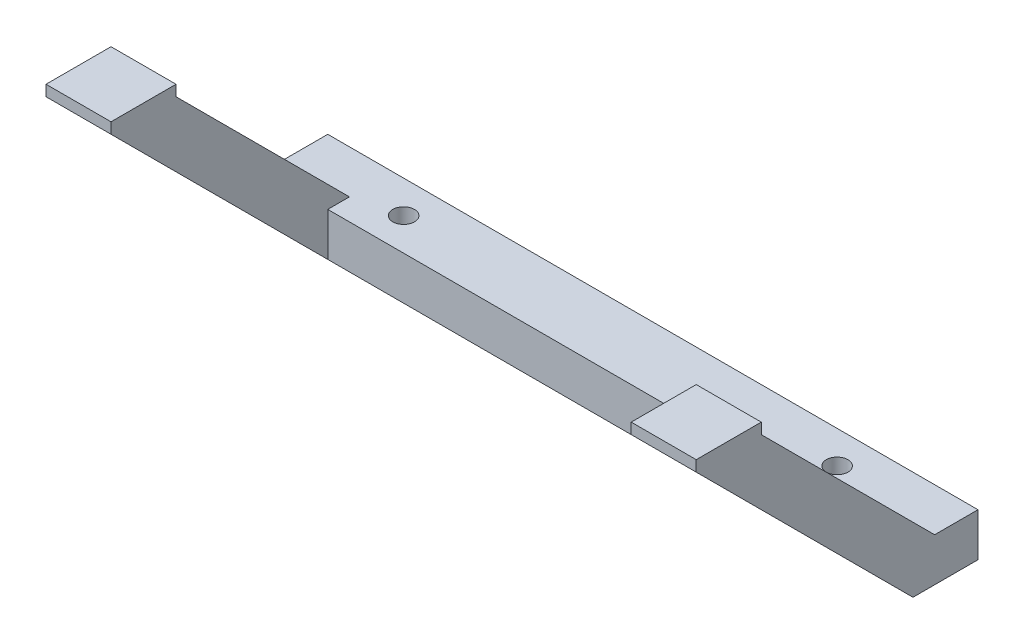
ISO-10303-21;
HEADER;
FILE_DESCRIPTION(('STEP AP214'),'2;1');
FILE_NAME('part.step','',(''),(''),'','','');
FILE_SCHEMA(('AUTOMOTIVE_DESIGN { 1 0 10303 214 1 1 1 1 }'));
ENDSEC;
DATA;
#1=APPLICATION_CONTEXT('core data for automotive mechanical design processes');
#2=APPLICATION_PROTOCOL_DEFINITION('international standard','automotive_design',2000,#1);
#3=PRODUCT_CONTEXT('',#1,'mechanical');
#4=PRODUCT('Part','Part','',(#3));
#5=PRODUCT_RELATED_PRODUCT_CATEGORY('part','',(#4));
#6=PRODUCT_DEFINITION_FORMATION('','',#4);
#7=PRODUCT_DEFINITION_CONTEXT('part definition',#1,'design');
#8=PRODUCT_DEFINITION('design','',#6,#7);
#9=PRODUCT_DEFINITION_SHAPE('','',#8);
#10=(LENGTH_UNIT() NAMED_UNIT(*) SI_UNIT(.MILLI.,.METRE.));
#11=(NAMED_UNIT(*) PLANE_ANGLE_UNIT() SI_UNIT($,.RADIAN.));
#12=(NAMED_UNIT(*) SI_UNIT($,.STERADIAN.) SOLID_ANGLE_UNIT());
#13=UNCERTAINTY_MEASURE_WITH_UNIT(LENGTH_MEASURE(1.E-05),#10,'distance_accuracy_value','');
#14=(GEOMETRIC_REPRESENTATION_CONTEXT(3) GLOBAL_UNCERTAINTY_ASSIGNED_CONTEXT((#13)) GLOBAL_UNIT_ASSIGNED_CONTEXT((#10,
#11,#12)) REPRESENTATION_CONTEXT('',''));
#15=CARTESIAN_POINT('',(0.,0.,0.));
#16=DIRECTION('',(0.,0.,1.));
#17=DIRECTION('',(1.,0.,0.));
#18=AXIS2_PLACEMENT_3D('',#15,#16,#17);
#19=CARTESIAN_POINT('',(-12.,2.,-1.5));
#20=DIRECTION('',(0.,0.,1.));
#21=DIRECTION('',(1.,0.,0.));
#22=AXIS2_PLACEMENT_3D('',#19,#20,#21);
#23=PLANE('',#22);
#24=DIRECTION('',(-1.,0.,0.));
#25=VECTOR('',#24,1.);
#26=CARTESIAN_POINT('',(-12.,0.,-1.5));
#27=LINE('',#26,#25);
#28=CARTESIAN_POINT('',(15.,0.,-1.5));
#29=VERTEX_POINT('',#28);
#30=CARTESIAN_POINT('',(-15.,0.,-1.5));
#31=VERTEX_POINT('',#30);
#32=EDGE_CURVE('E314',#29,#31,#27,.T.);
#33=ORIENTED_EDGE('',*,*,#32,.T.);
#34=DIRECTION('',(0.,-1.,0.));
#35=VECTOR('',#34,1.);
#36=CARTESIAN_POINT('',(-15.,2.,-1.5));
#37=LINE('',#36,#35);
#38=CARTESIAN_POINT('',(-15.,2.,-1.5));
#39=VERTEX_POINT('',#38);
#40=EDGE_CURVE('E263',#39,#31,#37,.T.);
#41=ORIENTED_EDGE('',*,*,#40,.F.);
#42=DIRECTION('',(-1.,0.,0.));
#43=VECTOR('',#42,1.);
#44=CARTESIAN_POINT('',(-12.,2.,-1.5));
#45=LINE('',#44,#43);
#46=CARTESIAN_POINT('',(15.,2.,-1.5));
#47=VERTEX_POINT('',#46);
#48=EDGE_CURVE('E317',#47,#39,#45,.T.);
#49=ORIENTED_EDGE('',*,*,#48,.F.);
#50=DIRECTION('',(0.,1.,0.));
#51=VECTOR('',#50,1.);
#52=CARTESIAN_POINT('',(15.,0.,-1.5));
#53=LINE('',#52,#51);
#54=EDGE_CURVE('E290',#29,#47,#53,.T.);
#55=ORIENTED_EDGE('',*,*,#54,.F.);
#56=EDGE_LOOP('',(#33,#41,#49,#55));
#57=FACE_BOUND('',#56,.T.);
#58=ADVANCED_FACE('F43',(#57),#23,.F.);
#59=CARTESIAN_POINT('',(-12.,2.,1.5));
#60=DIRECTION('',(0.,0.,-1.));
#61=DIRECTION('',(-1.,0.,0.));
#62=AXIS2_PLACEMENT_3D('',#59,#60,#61);
#63=PLANE('',#62);
#64=DIRECTION('',(1.,0.,0.));
#65=VECTOR('',#64,1.);
#66=CARTESIAN_POINT('',(-12.,0.,1.5));
#67=LINE('',#66,#65);
#68=CARTESIAN_POINT('',(-12.,0.,1.5));
#69=VERTEX_POINT('',#68);
#70=CARTESIAN_POINT('',(12.,0.,1.5));
#71=VERTEX_POINT('',#70);
#72=EDGE_CURVE('E318',#69,#71,#67,.T.);
#73=ORIENTED_EDGE('',*,*,#72,.T.);
#74=DIRECTION('',(0.,-1.,0.));
#75=VECTOR('',#74,1.);
#76=CARTESIAN_POINT('',(12.,2.,1.5));
#77=LINE('',#76,#75);
#78=CARTESIAN_POINT('',(12.,2.,1.5));
#79=VERTEX_POINT('',#78);
#80=EDGE_CURVE('E51',#79,#71,#77,.T.);
#81=ORIENTED_EDGE('',*,*,#80,.F.);
#82=DIRECTION('',(1.,0.,0.));
#83=VECTOR('',#82,1.);
#84=CARTESIAN_POINT('',(-12.,2.,1.5));
#85=LINE('',#84,#83);
#86=CARTESIAN_POINT('',(-12.,2.,1.5));
#87=VERTEX_POINT('',#86);
#88=EDGE_CURVE('E63',#87,#79,#85,.T.);
#89=ORIENTED_EDGE('',*,*,#88,.F.);
#90=DIRECTION('',(0.,-1.,0.));
#91=VECTOR('',#90,1.);
#92=CARTESIAN_POINT('',(-12.,2.,1.5));
#93=LINE('',#92,#91);
#94=EDGE_CURVE('E11',#87,#69,#93,.T.);
#95=ORIENTED_EDGE('',*,*,#94,.T.);
#96=EDGE_LOOP('',(#73,#81,#89,#95));
#97=FACE_BOUND('',#96,.T.);
#98=ADVANCED_FACE('F356',(#97),#63,.F.);
#99=CARTESIAN_POINT('',(0.,2.,0.));
#100=DIRECTION('',(0.,1.,0.));
#101=DIRECTION('',(0.,0.,1.));
#102=AXIS2_PLACEMENT_3D('',#99,#100,#101);
#103=PLANE('',#102);
#104=CARTESIAN_POINT('',(-10.,2.,0.));
#105=DIRECTION('',(0.,1.,0.));
#106=DIRECTION('',(0.,0.,1.));
#107=AXIS2_PLACEMENT_3D('',#104,#105,#106);
#108=CIRCLE('',#107,0.499999999999999);
#109=CARTESIAN_POINT('',(-10.,2.,0.499999999999999));
#110=VERTEX_POINT('',#109);
#111=EDGE_CURVE('E237',#110,#110,#108,.F.);
#112=ORIENTED_EDGE('',*,*,#111,.T.);
#113=EDGE_LOOP('',(#112));
#114=FACE_BOUND('',#113,.T.);
#115=CARTESIAN_POINT('',(10.,2.,0.));
#116=DIRECTION('',(0.,1.,0.));
#117=DIRECTION('',(0.,0.,1.));
#118=AXIS2_PLACEMENT_3D('',#115,#116,#117);
#119=CIRCLE('',#118,0.500000000000001);
#120=CARTESIAN_POINT('',(10.,2.,0.500000000000001));
#121=VERTEX_POINT('',#120);
#122=EDGE_CURVE('E241',#121,#121,#119,.F.);
#123=ORIENTED_EDGE('',*,*,#122,.T.);
#124=EDGE_LOOP('',(#123));
#125=FACE_BOUND('',#124,.T.);
#126=DIRECTION('',(0.,0.,-1.));
#127=VECTOR('',#126,1.);
#128=CARTESIAN_POINT('',(12.,2.,-1.5));
#129=LINE('',#128,#127);
#130=CARTESIAN_POINT('',(12.,2.,0.499999999999998));
#131=VERTEX_POINT('',#130);
#132=EDGE_CURVE('E58',#79,#131,#129,.T.);
#133=ORIENTED_EDGE('',*,*,#132,.T.);
#134=DIRECTION('',(-1.,0.,0.));
#135=VECTOR('',#134,1.);
#136=CARTESIAN_POINT('',(15.,2.,0.500000000000002));
#137=LINE('',#136,#135);
#138=CARTESIAN_POINT('',(15.,2.,0.500000000000002));
#139=VERTEX_POINT('',#138);
#140=EDGE_CURVE('E157',#139,#131,#137,.T.);
#141=ORIENTED_EDGE('',*,*,#140,.F.);
#142=DIRECTION('',(0.,0.,1.));
#143=VECTOR('',#142,1.);
#144=CARTESIAN_POINT('',(15.,2.,-1.5));
#145=LINE('',#144,#143);
#146=EDGE_CURVE('E294',#47,#139,#145,.T.);
#147=ORIENTED_EDGE('',*,*,#146,.F.);
#148=ORIENTED_EDGE('',*,*,#48,.T.);
#149=DIRECTION('',(0.,0.,-1.));
#150=VECTOR('',#149,1.);
#151=CARTESIAN_POINT('',(-15.,2.,0.499999999999983));
#152=LINE('',#151,#150);
#153=CARTESIAN_POINT('',(-15.,2.,0.499999999999983));
#154=VERTEX_POINT('',#153);
#155=EDGE_CURVE('E259',#154,#39,#152,.T.);
#156=ORIENTED_EDGE('',*,*,#155,.F.);
#157=DIRECTION('',(1.,0.,0.));
#158=VECTOR('',#157,1.);
#159=CARTESIAN_POINT('',(-15.,2.,0.499999999999983));
#160=LINE('',#159,#158);
#161=CARTESIAN_POINT('',(-12.,2.,0.499999999999984));
#162=VERTEX_POINT('',#161);
#163=EDGE_CURVE('E267',#154,#162,#160,.T.);
#164=ORIENTED_EDGE('',*,*,#163,.T.);
#165=DIRECTION('',(0.,0.,1.));
#166=VECTOR('',#165,1.);
#167=CARTESIAN_POINT('',(-12.,2.,-1.5));
#168=LINE('',#167,#166);
#169=EDGE_CURVE('E321',#162,#87,#168,.T.);
#170=ORIENTED_EDGE('',*,*,#169,.T.);
#171=ORIENTED_EDGE('',*,*,#88,.T.);
#172=EDGE_LOOP('',(#133,#141,#147,#148,#156,#164,#170,#171));
#173=FACE_BOUND('',#172,.T.);
#174=ADVANCED_FACE('F354',(#114,#125,#173),#103,.T.);
#175=CARTESIAN_POINT('',(0.,0.,0.));
#176=DIRECTION('',(0.,1.,0.));
#177=DIRECTION('',(0.,0.,1.));
#178=AXIS2_PLACEMENT_3D('',#175,#176,#177);
#179=PLANE('',#178);
#180=CARTESIAN_POINT('',(-10.,0.,0.));
#181=DIRECTION('',(0.,-1.,0.));
#182=DIRECTION('',(0.,0.,-1.));
#183=AXIS2_PLACEMENT_3D('',#180,#181,#182);
#184=CIRCLE('',#183,0.499999999999999);
#185=CARTESIAN_POINT('',(-10.,0.,-0.499999999999999));
#186=VERTEX_POINT('',#185);
#187=EDGE_CURVE('E232',#186,#186,#184,.T.);
#188=ORIENTED_EDGE('',*,*,#187,.F.);
#189=EDGE_LOOP('',(#188));
#190=FACE_BOUND('',#189,.T.);
#191=CARTESIAN_POINT('',(10.,0.,0.));
#192=DIRECTION('',(0.,-1.,0.));
#193=DIRECTION('',(0.,0.,-1.));
#194=AXIS2_PLACEMENT_3D('',#191,#192,#193);
#195=CIRCLE('',#194,0.500000000000001);
#196=CARTESIAN_POINT('',(10.,0.,-0.500000000000001));
#197=VERTEX_POINT('',#196);
#198=EDGE_CURVE('E231',#197,#197,#195,.T.);
#199=ORIENTED_EDGE('',*,*,#198,.F.);
#200=EDGE_LOOP('',(#199));
#201=FACE_BOUND('',#200,.T.);
#202=ORIENTED_EDGE('',*,*,#32,.F.);
#203=DIRECTION('',(0.,0.,-1.));
#204=VECTOR('',#203,1.);
#205=CARTESIAN_POINT('',(15.,0.,-1.5));
#206=LINE('',#205,#204);
#207=CARTESIAN_POINT('',(15.,0.,1.5));
#208=VERTEX_POINT('',#207);
#209=EDGE_CURVE('E286',#208,#29,#206,.T.);
#210=ORIENTED_EDGE('',*,*,#209,.F.);
#211=DIRECTION('',(-1.,0.,0.));
#212=VECTOR('',#211,1.);
#213=CARTESIAN_POINT('',(15.,0.,1.5));
#214=LINE('',#213,#212);
#215=EDGE_CURVE('E302',#208,#71,#214,.T.);
#216=ORIENTED_EDGE('',*,*,#215,.T.);
#217=ORIENTED_EDGE('',*,*,#72,.F.);
#218=DIRECTION('',(1.,0.,0.));
#219=VECTOR('',#218,1.);
#220=CARTESIAN_POINT('',(-15.,0.,1.5));
#221=LINE('',#220,#219);
#222=CARTESIAN_POINT('',(-15.,0.,1.5));
#223=VERTEX_POINT('',#222);
#224=EDGE_CURVE('E162',#223,#69,#221,.T.);
#225=ORIENTED_EDGE('',*,*,#224,.F.);
#226=DIRECTION('',(0.,0.,1.));
#227=VECTOR('',#226,1.);
#228=CARTESIAN_POINT('',(-15.,0.,-1.5));
#229=LINE('',#228,#227);
#230=EDGE_CURVE('E248',#31,#223,#229,.T.);
#231=ORIENTED_EDGE('',*,*,#230,.F.);
#232=EDGE_LOOP('',(#202,#210,#216,#217,#225,#231));
#233=FACE_BOUND('',#232,.T.);
#234=ADVANCED_FACE('F340',(#190,#201,#233),#179,.F.);
#235=CARTESIAN_POINT('',(12.,0.,0.));
#236=DIRECTION('',(-1.,0.,0.));
#237=DIRECTION('',(0.,0.,1.));
#238=AXIS2_PLACEMENT_3D('',#235,#236,#237);
#239=PLANE('',#238);
#240=ORIENTED_EDGE('',*,*,#132,.F.);
#241=ORIENTED_EDGE('',*,*,#80,.T.);
#242=DIRECTION('',(0.,-0.707106781186548,-0.707106781186548));
#243=VECTOR('',#242,1.);
#244=CARTESIAN_POINT('',(12.,9.99999999999997,11.5));
#245=LINE('',#244,#243);
#246=CARTESIAN_POINT('',(12.,9.99999999999997,11.5));
#247=VERTEX_POINT('',#246);
#248=EDGE_CURVE('E161',#247,#71,#245,.T.);
#249=ORIENTED_EDGE('',*,*,#248,.F.);
#250=DIRECTION('',(0.,-1.,0.));
#251=VECTOR('',#250,1.);
#252=CARTESIAN_POINT('',(12.,10.5,11.5));
#253=LINE('',#252,#251);
#254=CARTESIAN_POINT('',(12.,10.5,11.5));
#255=VERTEX_POINT('',#254);
#256=EDGE_CURVE('E178',#255,#247,#253,.T.);
#257=ORIENTED_EDGE('',*,*,#256,.F.);
#258=DIRECTION('',(0.,0.,1.));
#259=VECTOR('',#258,1.);
#260=CARTESIAN_POINT('',(12.,10.5,8.49999999999998));
#261=LINE('',#260,#259);
#262=CARTESIAN_POINT('',(12.,10.5,8.49999999999998));
#263=VERTEX_POINT('',#262);
#264=EDGE_CURVE('E176',#263,#255,#261,.T.);
#265=ORIENTED_EDGE('',*,*,#264,.F.);
#266=DIRECTION('',(0.,-1.,0.));
#267=VECTOR('',#266,1.);
#268=CARTESIAN_POINT('',(12.,10.5,8.49999999999998));
#269=LINE('',#268,#267);
#270=CARTESIAN_POINT('',(12.,9.99999999999997,8.49999999999998));
#271=VERTEX_POINT('',#270);
#272=EDGE_CURVE('E167',#263,#271,#269,.T.);
#273=ORIENTED_EDGE('',*,*,#272,.T.);
#274=DIRECTION('',(0.,0.707106781186548,0.707106781186548));
#275=VECTOR('',#274,1.);
#276=CARTESIAN_POINT('',(12.,9.99999999999997,8.49999999999997));
#277=LINE('',#276,#275);
#278=EDGE_CURVE('E151',#131,#271,#277,.T.);
#279=ORIENTED_EDGE('',*,*,#278,.F.);
#280=EDGE_LOOP('',(#240,#241,#249,#257,#265,#273,#279));
#281=FACE_BOUND('',#280,.T.);
#282=ADVANCED_FACE('F174',(#281),#239,.T.);
#283=CARTESIAN_POINT('',(15.,9.99999999999997,8.49999999999997));
#284=DIRECTION('',(0.,-0.707106781186547,0.707106781186547));
#285=DIRECTION('',(0.,-0.707106781186548,-0.707106781186548));
#286=AXIS2_PLACEMENT_3D('',#283,#284,#285);
#287=PLANE('',#286);
#288=ORIENTED_EDGE('',*,*,#278,.T.);
#289=DIRECTION('',(-1.,0.,0.));
#290=VECTOR('',#289,1.);
#291=CARTESIAN_POINT('',(15.,9.99999999999997,8.49999999999997));
#292=LINE('',#291,#290);
#293=CARTESIAN_POINT('',(15.,9.99999999999997,8.49999999999997));
#294=VERTEX_POINT('',#293);
#295=EDGE_CURVE('E155',#294,#271,#292,.T.);
#296=ORIENTED_EDGE('',*,*,#295,.F.);
#297=DIRECTION('',(0.,0.707106781186548,0.707106781186548));
#298=VECTOR('',#297,1.);
#299=CARTESIAN_POINT('',(15.,9.99999999999997,8.49999999999997));
#300=LINE('',#299,#298);
#301=EDGE_CURVE('E297',#139,#294,#300,.T.);
#302=ORIENTED_EDGE('',*,*,#301,.F.);
#303=ORIENTED_EDGE('',*,*,#140,.T.);
#304=EDGE_LOOP('',(#288,#296,#302,#303));
#305=FACE_BOUND('',#304,.T.);
#306=ADVANCED_FACE('F153',(#305),#287,.F.);
#307=CARTESIAN_POINT('',(15.,9.99999999999997,11.5));
#308=DIRECTION('',(0.,0.707106781186547,-0.707106781186547));
#309=DIRECTION('',(0.,0.707106781186548,0.707106781186548));
#310=AXIS2_PLACEMENT_3D('',#307,#308,#309);
#311=PLANE('',#310);
#312=ORIENTED_EDGE('',*,*,#248,.T.);
#313=ORIENTED_EDGE('',*,*,#215,.F.);
#314=DIRECTION('',(0.,-0.707106781186548,-0.707106781186548));
#315=VECTOR('',#314,1.);
#316=CARTESIAN_POINT('',(15.,9.99999999999997,11.5));
#317=LINE('',#316,#315);
#318=CARTESIAN_POINT('',(15.,9.99999999999997,11.5));
#319=VERTEX_POINT('',#318);
#320=EDGE_CURVE('E300',#319,#208,#317,.T.);
#321=ORIENTED_EDGE('',*,*,#320,.F.);
#322=DIRECTION('',(-1.,0.,0.));
#323=VECTOR('',#322,1.);
#324=CARTESIAN_POINT('',(15.,9.99999999999997,11.5));
#325=LINE('',#324,#323);
#326=EDGE_CURVE('E172',#319,#247,#325,.T.);
#327=ORIENTED_EDGE('',*,*,#326,.T.);
#328=EDGE_LOOP('',(#312,#313,#321,#327));
#329=FACE_BOUND('',#328,.T.);
#330=ADVANCED_FACE('F335',(#329),#311,.F.);
#331=CARTESIAN_POINT('',(15.,0.,0.));
#332=DIRECTION('',(-1.,0.,0.));
#333=DIRECTION('',(0.,0.,1.));
#334=AXIS2_PLACEMENT_3D('',#331,#332,#333);
#335=PLANE('',#334);
#336=ORIENTED_EDGE('',*,*,#209,.T.);
#337=ORIENTED_EDGE('',*,*,#54,.T.);
#338=ORIENTED_EDGE('',*,*,#146,.T.);
#339=ORIENTED_EDGE('',*,*,#301,.T.);
#340=DIRECTION('',(0.,-1.,0.));
#341=VECTOR('',#340,1.);
#342=CARTESIAN_POINT('',(15.,10.5,8.49999999999998));
#343=LINE('',#342,#341);
#344=CARTESIAN_POINT('',(15.,10.5,8.49999999999998));
#345=VERTEX_POINT('',#344);
#346=EDGE_CURVE('E170',#345,#294,#343,.T.);
#347=ORIENTED_EDGE('',*,*,#346,.F.);
#348=DIRECTION('',(0.,0.,-1.));
#349=VECTOR('',#348,1.);
#350=CARTESIAN_POINT('',(15.,10.5,8.49999999999998));
#351=LINE('',#350,#349);
#352=CARTESIAN_POINT('',(15.,10.5,11.5));
#353=VERTEX_POINT('',#352);
#354=EDGE_CURVE('E198',#353,#345,#351,.T.);
#355=ORIENTED_EDGE('',*,*,#354,.F.);
#356=DIRECTION('',(0.,-1.,0.));
#357=VECTOR('',#356,1.);
#358=CARTESIAN_POINT('',(15.,10.5,11.5));
#359=LINE('',#358,#357);
#360=EDGE_CURVE('E183',#353,#319,#359,.T.);
#361=ORIENTED_EDGE('',*,*,#360,.T.);
#362=ORIENTED_EDGE('',*,*,#320,.T.);
#363=EDGE_LOOP('',(#336,#337,#338,#339,#347,#355,#361,#362));
#364=FACE_BOUND('',#363,.T.);
#365=ADVANCED_FACE('F345',(#364),#335,.F.);
#366=CARTESIAN_POINT('',(-12.,0.,0.));
#367=DIRECTION('',(1.,0.,0.));
#368=DIRECTION('',(0.,0.,-1.));
#369=AXIS2_PLACEMENT_3D('',#366,#367,#368);
#370=PLANE('',#369);
#371=ORIENTED_EDGE('',*,*,#94,.F.);
#372=ORIENTED_EDGE('',*,*,#169,.F.);
#373=DIRECTION('',(0.,-0.707106781186548,-0.707106781186548));
#374=VECTOR('',#373,1.);
#375=CARTESIAN_POINT('',(-12.,9.99999999999997,8.49999999999995));
#376=LINE('',#375,#374);
#377=CARTESIAN_POINT('',(-12.,9.99999999999997,8.49999999999995));
#378=VERTEX_POINT('',#377);
#379=EDGE_CURVE('E253',#378,#162,#376,.T.);
#380=ORIENTED_EDGE('',*,*,#379,.F.);
#381=DIRECTION('',(0.,-1.,0.));
#382=VECTOR('',#381,1.);
#383=CARTESIAN_POINT('',(-12.,10.5,8.49999999999995));
#384=LINE('',#383,#382);
#385=CARTESIAN_POINT('',(-12.,10.5,8.49999999999995));
#386=VERTEX_POINT('',#385);
#387=EDGE_CURVE('E227',#386,#378,#384,.T.);
#388=ORIENTED_EDGE('',*,*,#387,.F.);
#389=DIRECTION('',(0.,0.,-1.));
#390=VECTOR('',#389,1.);
#391=CARTESIAN_POINT('',(-12.,10.5,8.49999999999995));
#392=LINE('',#391,#390);
#393=CARTESIAN_POINT('',(-12.,10.5,11.5));
#394=VERTEX_POINT('',#393);
#395=EDGE_CURVE('E202',#394,#386,#392,.T.);
#396=ORIENTED_EDGE('',*,*,#395,.F.);
#397=DIRECTION('',(0.,-1.,0.));
#398=VECTOR('',#397,1.);
#399=CARTESIAN_POINT('',(-12.,10.5,11.5));
#400=LINE('',#399,#398);
#401=CARTESIAN_POINT('',(-12.,9.99999999999997,11.5));
#402=VERTEX_POINT('',#401);
#403=EDGE_CURVE('E215',#394,#402,#400,.T.);
#404=ORIENTED_EDGE('',*,*,#403,.T.);
#405=DIRECTION('',(0.,0.707106781186548,0.707106781186547));
#406=VECTOR('',#405,1.);
#407=CARTESIAN_POINT('',(-12.,0.,1.5));
#408=LINE('',#407,#406);
#409=EDGE_CURVE('E236',#69,#402,#408,.T.);
#410=ORIENTED_EDGE('',*,*,#409,.F.);
#411=EDGE_LOOP('',(#371,#372,#380,#388,#396,#404,#410));
#412=FACE_BOUND('',#411,.T.);
#413=ADVANCED_FACE('F379',(#412),#370,.T.);
#414=CARTESIAN_POINT('',(-15.,0.,1.5));
#415=DIRECTION('',(0.,0.707106781186547,-0.707106781186548));
#416=DIRECTION('',(0.,0.707106781186548,0.707106781186547));
#417=AXIS2_PLACEMENT_3D('',#414,#415,#416);
#418=PLANE('',#417);
#419=ORIENTED_EDGE('',*,*,#409,.T.);
#420=DIRECTION('',(1.,0.,0.));
#421=VECTOR('',#420,1.);
#422=CARTESIAN_POINT('',(-15.,9.99999999999997,11.5));
#423=LINE('',#422,#421);
#424=CARTESIAN_POINT('',(-15.,9.99999999999997,11.5));
#425=VERTEX_POINT('',#424);
#426=EDGE_CURVE('E279',#425,#402,#423,.T.);
#427=ORIENTED_EDGE('',*,*,#426,.F.);
#428=DIRECTION('',(0.,0.707106781186548,0.707106781186547));
#429=VECTOR('',#428,1.);
#430=CARTESIAN_POINT('',(-15.,0.,1.5));
#431=LINE('',#430,#429);
#432=EDGE_CURVE('E252',#223,#425,#431,.T.);
#433=ORIENTED_EDGE('',*,*,#432,.F.);
#434=ORIENTED_EDGE('',*,*,#224,.T.);
#435=EDGE_LOOP('',(#419,#427,#433,#434));
#436=FACE_BOUND('',#435,.T.);
#437=ADVANCED_FACE('F376',(#436),#418,.F.);
#438=CARTESIAN_POINT('',(-15.,9.99999999999997,8.49999999999995));
#439=DIRECTION('',(0.,-0.707106781186548,0.707106781186547));
#440=DIRECTION('',(0.,-0.707106781186547,-0.707106781186548));
#441=AXIS2_PLACEMENT_3D('',#438,#439,#440);
#442=PLANE('',#441);
#443=ORIENTED_EDGE('',*,*,#379,.T.);
#444=ORIENTED_EDGE('',*,*,#163,.F.);
#445=DIRECTION('',(0.,-0.707106781186548,-0.707106781186548));
#446=VECTOR('',#445,1.);
#447=CARTESIAN_POINT('',(-15.,9.99999999999997,8.49999999999995));
#448=LINE('',#447,#446);
#449=CARTESIAN_POINT('',(-15.,9.99999999999997,8.49999999999995));
#450=VERTEX_POINT('',#449);
#451=EDGE_CURVE('E256',#450,#154,#448,.T.);
#452=ORIENTED_EDGE('',*,*,#451,.F.);
#453=DIRECTION('',(1.,0.,0.));
#454=VECTOR('',#453,1.);
#455=CARTESIAN_POINT('',(-15.,9.99999999999997,8.49999999999995));
#456=LINE('',#455,#454);
#457=EDGE_CURVE('E276',#450,#378,#456,.T.);
#458=ORIENTED_EDGE('',*,*,#457,.T.);
#459=EDGE_LOOP('',(#443,#444,#452,#458));
#460=FACE_BOUND('',#459,.T.);
#461=ADVANCED_FACE('F383',(#460),#442,.F.);
#462=CARTESIAN_POINT('',(-15.,0.,0.));
#463=DIRECTION('',(1.,0.,0.));
#464=DIRECTION('',(0.,0.,-1.));
#465=AXIS2_PLACEMENT_3D('',#462,#463,#464);
#466=PLANE('',#465);
#467=ORIENTED_EDGE('',*,*,#230,.T.);
#468=ORIENTED_EDGE('',*,*,#432,.T.);
#469=DIRECTION('',(0.,-1.,0.));
#470=VECTOR('',#469,1.);
#471=CARTESIAN_POINT('',(-15.,10.5,11.5));
#472=LINE('',#471,#470);
#473=CARTESIAN_POINT('',(-15.,10.5,11.5));
#474=VERTEX_POINT('',#473);
#475=EDGE_CURVE('E219',#474,#425,#472,.T.);
#476=ORIENTED_EDGE('',*,*,#475,.F.);
#477=DIRECTION('',(0.,0.,1.));
#478=VECTOR('',#477,1.);
#479=CARTESIAN_POINT('',(-15.,10.5,8.49999999999995));
#480=LINE('',#479,#478);
#481=CARTESIAN_POINT('',(-15.,10.5,8.49999999999995));
#482=VERTEX_POINT('',#481);
#483=EDGE_CURVE('E209',#482,#474,#480,.T.);
#484=ORIENTED_EDGE('',*,*,#483,.F.);
#485=DIRECTION('',(0.,-1.,0.));
#486=VECTOR('',#485,1.);
#487=CARTESIAN_POINT('',(-15.,10.5,8.49999999999995));
#488=LINE('',#487,#486);
#489=EDGE_CURVE('E223',#482,#450,#488,.T.);
#490=ORIENTED_EDGE('',*,*,#489,.T.);
#491=ORIENTED_EDGE('',*,*,#451,.T.);
#492=ORIENTED_EDGE('',*,*,#155,.T.);
#493=ORIENTED_EDGE('',*,*,#40,.T.);
#494=EDGE_LOOP('',(#467,#468,#476,#484,#490,#491,#492,#493));
#495=FACE_BOUND('',#494,.T.);
#496=ADVANCED_FACE('F373',(#495),#466,.F.);
#497=CARTESIAN_POINT('',(10.,10.001,0.));
#498=DIRECTION('',(0.,-1.,0.));
#499=DIRECTION('',(0.,0.,-1.));
#500=AXIS2_PLACEMENT_3D('',#497,#498,#499);
#501=CYLINDRICAL_SURFACE('',#500,0.500000000000001);
#502=ORIENTED_EDGE('',*,*,#122,.F.);
#503=EDGE_LOOP('',(#502));
#504=FACE_BOUND('',#503,.T.);
#505=ORIENTED_EDGE('',*,*,#198,.T.);
#506=EDGE_LOOP('',(#505));
#507=FACE_BOUND('',#506,.T.);
#508=ADVANCED_FACE('F411',(#504,#507),#501,.F.);
#509=CARTESIAN_POINT('',(-10.,10.001,0.));
#510=DIRECTION('',(0.,-1.,0.));
#511=DIRECTION('',(0.,0.,-1.));
#512=AXIS2_PLACEMENT_3D('',#509,#510,#511);
#513=CYLINDRICAL_SURFACE('',#512,0.499999999999999);
#514=ORIENTED_EDGE('',*,*,#111,.F.);
#515=EDGE_LOOP('',(#514));
#516=FACE_BOUND('',#515,.T.);
#517=ORIENTED_EDGE('',*,*,#187,.T.);
#518=EDGE_LOOP('',(#517));
#519=FACE_BOUND('',#518,.T.);
#520=ADVANCED_FACE('F405',(#516,#519),#513,.F.);
#521=CARTESIAN_POINT('',(-15.,10.5,8.49999999999995));
#522=DIRECTION('',(0.,0.,1.));
#523=DIRECTION('',(1.,0.,0.));
#524=AXIS2_PLACEMENT_3D('',#521,#522,#523);
#525=PLANE('',#524);
#526=ORIENTED_EDGE('',*,*,#457,.F.);
#527=ORIENTED_EDGE('',*,*,#489,.F.);
#528=DIRECTION('',(-1.,0.,0.));
#529=VECTOR('',#528,1.);
#530=CARTESIAN_POINT('',(-15.,10.5,8.49999999999995));
#531=LINE('',#530,#529);
#532=EDGE_CURVE('E206',#386,#482,#531,.T.);
#533=ORIENTED_EDGE('',*,*,#532,.F.);
#534=ORIENTED_EDGE('',*,*,#387,.T.);
#535=EDGE_LOOP('',(#526,#527,#533,#534));
#536=FACE_BOUND('',#535,.T.);
#537=ADVANCED_FACE('F388',(#536),#525,.F.);
#538=CARTESIAN_POINT('',(-15.,10.5,11.5));
#539=DIRECTION('',(0.,0.,-1.));
#540=DIRECTION('',(-1.,0.,0.));
#541=AXIS2_PLACEMENT_3D('',#538,#539,#540);
#542=PLANE('',#541);
#543=ORIENTED_EDGE('',*,*,#426,.T.);
#544=ORIENTED_EDGE('',*,*,#403,.F.);
#545=DIRECTION('',(1.,0.,0.));
#546=VECTOR('',#545,1.);
#547=CARTESIAN_POINT('',(-15.,10.5,11.5));
#548=LINE('',#547,#546);
#549=EDGE_CURVE('E212',#474,#394,#548,.T.);
#550=ORIENTED_EDGE('',*,*,#549,.F.);
#551=ORIENTED_EDGE('',*,*,#475,.T.);
#552=EDGE_LOOP('',(#543,#544,#550,#551));
#553=FACE_BOUND('',#552,.T.);
#554=ADVANCED_FACE('F396',(#553),#542,.F.);
#555=CARTESIAN_POINT('',(0.,10.5,0.));
#556=DIRECTION('',(0.,1.,0.));
#557=DIRECTION('',(0.,0.,1.));
#558=AXIS2_PLACEMENT_3D('',#555,#556,#557);
#559=PLANE('',#558);
#560=ORIENTED_EDGE('',*,*,#395,.T.);
#561=ORIENTED_EDGE('',*,*,#532,.T.);
#562=ORIENTED_EDGE('',*,*,#483,.T.);
#563=ORIENTED_EDGE('',*,*,#549,.T.);
#564=EDGE_LOOP('',(#560,#561,#562,#563));
#565=FACE_BOUND('',#564,.T.);
#566=ADVANCED_FACE('F392',(#565),#559,.T.);
#567=CARTESIAN_POINT('',(12.,10.5,8.49999999999998));
#568=DIRECTION('',(0.,0.,1.));
#569=DIRECTION('',(1.,0.,0.));
#570=AXIS2_PLACEMENT_3D('',#567,#568,#569);
#571=PLANE('',#570);
#572=ORIENTED_EDGE('',*,*,#295,.T.);
#573=ORIENTED_EDGE('',*,*,#272,.F.);
#574=DIRECTION('',(-1.,0.,0.));
#575=VECTOR('',#574,1.);
#576=CARTESIAN_POINT('',(12.,10.5,8.49999999999998));
#577=LINE('',#576,#575);
#578=EDGE_CURVE('E195',#345,#263,#577,.T.);
#579=ORIENTED_EDGE('',*,*,#578,.F.);
#580=ORIENTED_EDGE('',*,*,#346,.T.);
#581=EDGE_LOOP('',(#572,#573,#579,#580));
#582=FACE_BOUND('',#581,.T.);
#583=ADVANCED_FACE('F166',(#582),#571,.F.);
#584=CARTESIAN_POINT('',(12.,10.5,11.5));
#585=DIRECTION('',(0.,0.,-1.));
#586=DIRECTION('',(-1.,0.,0.));
#587=AXIS2_PLACEMENT_3D('',#584,#585,#586);
#588=PLANE('',#587);
#589=ORIENTED_EDGE('',*,*,#326,.F.);
#590=ORIENTED_EDGE('',*,*,#360,.F.);
#591=DIRECTION('',(1.,0.,0.));
#592=VECTOR('',#591,1.);
#593=CARTESIAN_POINT('',(12.,10.5,11.5));
#594=LINE('',#593,#592);
#595=EDGE_CURVE('E190',#255,#353,#594,.T.);
#596=ORIENTED_EDGE('',*,*,#595,.F.);
#597=ORIENTED_EDGE('',*,*,#256,.T.);
#598=EDGE_LOOP('',(#589,#590,#596,#597));
#599=FACE_BOUND('',#598,.T.);
#600=ADVANCED_FACE('F350',(#599),#588,.F.);
#601=CARTESIAN_POINT('',(0.,10.5,0.));
#602=DIRECTION('',(0.,1.,0.));
#603=DIRECTION('',(0.,0.,1.));
#604=AXIS2_PLACEMENT_3D('',#601,#602,#603);
#605=PLANE('',#604);
#606=ORIENTED_EDGE('',*,*,#354,.T.);
#607=ORIENTED_EDGE('',*,*,#578,.T.);
#608=ORIENTED_EDGE('',*,*,#264,.T.);
#609=ORIENTED_EDGE('',*,*,#595,.T.);
#610=EDGE_LOOP('',(#606,#607,#608,#609));
#611=FACE_BOUND('',#610,.T.);
#612=ADVANCED_FACE('F353',(#611),#605,.T.);
#613=CLOSED_SHELL('',(#58,#98,#174,#234,#282,#306,#330,#365,#413,#437,#461,#496,#508,#520,#537,
#554,#566,#583,#600,#612));
#614=MANIFOLD_SOLID_BREP('B2',#613);
#615=ADVANCED_BREP_SHAPE_REPRESENTATION('',(#18,#614),#14);
#616=SHAPE_DEFINITION_REPRESENTATION(#9,#615);
ENDSEC;
END-ISO-10303-21;
